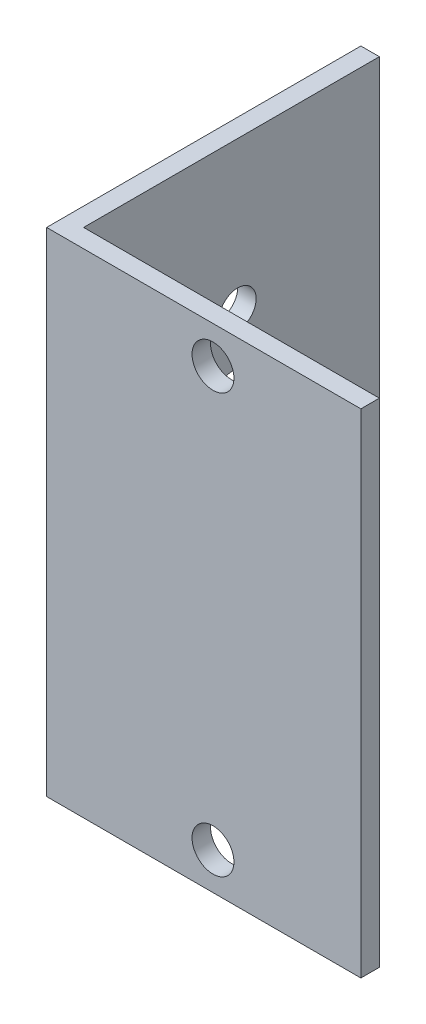
ISO-10303-21;
HEADER;
FILE_DESCRIPTION(('STEP AP214'),'2;1');
FILE_NAME('part.step','',(''),(''),'','','');
FILE_SCHEMA(('AUTOMOTIVE_DESIGN { 1 0 10303 214 1 1 1 1 }'));
ENDSEC;
DATA;
#1=APPLICATION_CONTEXT('core data for automotive mechanical design processes');
#2=APPLICATION_PROTOCOL_DEFINITION('international standard','automotive_design',2000,#1);
#3=PRODUCT_CONTEXT('',#1,'mechanical');
#4=PRODUCT('Part','Part','',(#3));
#5=PRODUCT_RELATED_PRODUCT_CATEGORY('part','',(#4));
#6=PRODUCT_DEFINITION_FORMATION('','',#4);
#7=PRODUCT_DEFINITION_CONTEXT('part definition',#1,'design');
#8=PRODUCT_DEFINITION('design','',#6,#7);
#9=PRODUCT_DEFINITION_SHAPE('','',#8);
#10=(LENGTH_UNIT() NAMED_UNIT(*) SI_UNIT(.MILLI.,.METRE.));
#11=(NAMED_UNIT(*) PLANE_ANGLE_UNIT() SI_UNIT($,.RADIAN.));
#12=(NAMED_UNIT(*) SI_UNIT($,.STERADIAN.) SOLID_ANGLE_UNIT());
#13=UNCERTAINTY_MEASURE_WITH_UNIT(LENGTH_MEASURE(1.E-05),#10,'distance_accuracy_value','');
#14=(GEOMETRIC_REPRESENTATION_CONTEXT(3) GLOBAL_UNCERTAINTY_ASSIGNED_CONTEXT((#13)) GLOBAL_UNIT_ASSIGNED_CONTEXT((#10,
#11,#12)) REPRESENTATION_CONTEXT('',''));
#15=CARTESIAN_POINT('',(0.,0.,0.));
#16=DIRECTION('',(0.,0.,1.));
#17=DIRECTION('',(1.,0.,0.));
#18=AXIS2_PLACEMENT_3D('',#15,#16,#17);
#19=CARTESIAN_POINT('',(24.,40.,0.));
#20=DIRECTION('',(0.,0.,1.));
#21=DIRECTION('',(1.,0.,0.));
#22=AXIS2_PLACEMENT_3D('',#19,#20,#21);
#23=PLANE('',#22);
#24=CARTESIAN_POINT('',(12.,3.,0.));
#25=DIRECTION('',(0.,0.,-1.));
#26=DIRECTION('',(-1.,0.,0.));
#27=AXIS2_PLACEMENT_3D('',#24,#25,#26);
#28=CIRCLE('',#27,1.7);
#29=CARTESIAN_POINT('',(10.3,3.,0.));
#30=VERTEX_POINT('',#29);
#31=EDGE_CURVE('E145',#30,#30,#28,.T.);
#32=ORIENTED_EDGE('',*,*,#31,.F.);
#33=EDGE_LOOP('',(#32));
#34=FACE_BOUND('',#33,.T.);
#35=CARTESIAN_POINT('',(12.,37.,0.));
#36=DIRECTION('',(0.,0.,-1.));
#37=DIRECTION('',(1.,0.,0.));
#38=AXIS2_PLACEMENT_3D('',#35,#36,#37);
#39=CIRCLE('',#38,1.7);
#40=CARTESIAN_POINT('',(13.7,37.,0.));
#41=VERTEX_POINT('',#40);
#42=EDGE_CURVE('E151',#41,#41,#39,.T.);
#43=ORIENTED_EDGE('',*,*,#42,.F.);
#44=EDGE_LOOP('',(#43));
#45=FACE_BOUND('',#44,.T.);
#46=DIRECTION('',(-1.,0.,0.));
#47=VECTOR('',#46,1.);
#48=CARTESIAN_POINT('',(24.,0.,0.));
#49=LINE('',#48,#47);
#50=CARTESIAN_POINT('',(24.,0.,0.));
#51=VERTEX_POINT('',#50);
#52=CARTESIAN_POINT('',(0.,0.,0.));
#53=VERTEX_POINT('',#52);
#54=EDGE_CURVE('E127',#51,#53,#49,.T.);
#55=ORIENTED_EDGE('',*,*,#54,.T.);
#56=DIRECTION('',(0.,-1.,0.));
#57=VECTOR('',#56,1.);
#58=CARTESIAN_POINT('',(0.,40.,0.));
#59=LINE('',#58,#57);
#60=CARTESIAN_POINT('',(0.,40.,0.));
#61=VERTEX_POINT('',#60);
#62=EDGE_CURVE('E12',#61,#53,#59,.T.);
#63=ORIENTED_EDGE('',*,*,#62,.F.);
#64=DIRECTION('',(-1.,0.,0.));
#65=VECTOR('',#64,1.);
#66=CARTESIAN_POINT('',(24.,40.,0.));
#67=LINE('',#66,#65);
#68=CARTESIAN_POINT('',(24.,40.,0.));
#69=VERTEX_POINT('',#68);
#70=EDGE_CURVE('E138',#69,#61,#67,.T.);
#71=ORIENTED_EDGE('',*,*,#70,.F.);
#72=DIRECTION('',(0.,-1.,0.));
#73=VECTOR('',#72,1.);
#74=CARTESIAN_POINT('',(24.,40.,0.));
#75=LINE('',#74,#73);
#76=EDGE_CURVE('E123',#69,#51,#75,.T.);
#77=ORIENTED_EDGE('',*,*,#76,.T.);
#78=EDGE_LOOP('',(#55,#63,#71,#77));
#79=FACE_BOUND('',#78,.T.);
#80=ADVANCED_FACE('F41',(#34,#45,#79),#23,.F.);
#81=CARTESIAN_POINT('',(0.,40.,0.));
#82=DIRECTION('',(-1.,0.,0.));
#83=DIRECTION('',(0.,0.,1.));
#84=AXIS2_PLACEMENT_3D('',#81,#82,#83);
#85=PLANE('',#84);
#86=CARTESIAN_POINT('',(0.,12.,-12.5));
#87=DIRECTION('',(-1.,0.,0.));
#88=DIRECTION('',(0.,0.,1.));
#89=AXIS2_PLACEMENT_3D('',#86,#87,#88);
#90=CIRCLE('',#89,1.5);
#91=CARTESIAN_POINT('',(0.,12.,-11.));
#92=VERTEX_POINT('',#91);
#93=EDGE_CURVE('E149',#92,#92,#90,.F.);
#94=ORIENTED_EDGE('',*,*,#93,.F.);
#95=EDGE_LOOP('',(#94));
#96=FACE_BOUND('',#95,.T.);
#97=CARTESIAN_POINT('',(0.,28.,-12.5));
#98=DIRECTION('',(-1.,0.,0.));
#99=DIRECTION('',(0.,0.,1.));
#100=AXIS2_PLACEMENT_3D('',#97,#98,#99);
#101=CIRCLE('',#100,1.5);
#102=CARTESIAN_POINT('',(0.,28.,-11.));
#103=VERTEX_POINT('',#102);
#104=EDGE_CURVE('E158',#103,#103,#101,.F.);
#105=ORIENTED_EDGE('',*,*,#104,.F.);
#106=EDGE_LOOP('',(#105));
#107=FACE_BOUND('',#106,.T.);
#108=CARTESIAN_POINT('',(0.,20.,-12.5));
#109=DIRECTION('',(-1.,0.,0.));
#110=DIRECTION('',(0.,0.,1.));
#111=AXIS2_PLACEMENT_3D('',#108,#109,#110);
#112=CIRCLE('',#111,3.9);
#113=CARTESIAN_POINT('',(0.,20.,-8.60000000000001));
#114=VERTEX_POINT('',#113);
#115=EDGE_CURVE('E131',#114,#114,#112,.F.);
#116=ORIENTED_EDGE('',*,*,#115,.F.);
#117=EDGE_LOOP('',(#116));
#118=FACE_BOUND('',#117,.T.);
#119=DIRECTION('',(0.,0.,-1.));
#120=VECTOR('',#119,1.);
#121=CARTESIAN_POINT('',(0.,0.,0.));
#122=LINE('',#121,#120);
#123=CARTESIAN_POINT('',(0.,0.,-24.));
#124=VERTEX_POINT('',#123);
#125=EDGE_CURVE('E130',#53,#124,#122,.T.);
#126=ORIENTED_EDGE('',*,*,#125,.T.);
#127=DIRECTION('',(0.,-1.,0.));
#128=VECTOR('',#127,1.);
#129=CARTESIAN_POINT('',(0.,40.,-24.));
#130=LINE('',#129,#128);
#131=CARTESIAN_POINT('',(0.,40.,-24.));
#132=VERTEX_POINT('',#131);
#133=EDGE_CURVE('E50',#132,#124,#130,.T.);
#134=ORIENTED_EDGE('',*,*,#133,.F.);
#135=DIRECTION('',(0.,0.,-1.));
#136=VECTOR('',#135,1.);
#137=CARTESIAN_POINT('',(0.,40.,0.));
#138=LINE('',#137,#136);
#139=EDGE_CURVE('E96',#61,#132,#138,.T.);
#140=ORIENTED_EDGE('',*,*,#139,.F.);
#141=ORIENTED_EDGE('',*,*,#62,.T.);
#142=EDGE_LOOP('',(#126,#134,#140,#141));
#143=FACE_BOUND('',#142,.T.);
#144=ADVANCED_FACE('F177',(#96,#107,#118,#143),#85,.F.);
#145=CARTESIAN_POINT('',(0.,40.,-24.));
#146=DIRECTION('',(0.,0.,1.));
#147=DIRECTION('',(1.,0.,0.));
#148=AXIS2_PLACEMENT_3D('',#145,#146,#147);
#149=PLANE('',#148);
#150=DIRECTION('',(-1.,0.,0.));
#151=VECTOR('',#150,1.);
#152=CARTESIAN_POINT('',(0.,0.,-24.));
#153=LINE('',#152,#151);
#154=CARTESIAN_POINT('',(-1.5,0.,-24.));
#155=VERTEX_POINT('',#154);
#156=EDGE_CURVE('E133',#124,#155,#153,.T.);
#157=ORIENTED_EDGE('',*,*,#156,.T.);
#158=DIRECTION('',(0.,-1.,0.));
#159=VECTOR('',#158,1.);
#160=CARTESIAN_POINT('',(-1.5,40.,-24.));
#161=LINE('',#160,#159);
#162=CARTESIAN_POINT('',(-1.5,40.,-24.));
#163=VERTEX_POINT('',#162);
#164=EDGE_CURVE('E118',#163,#155,#161,.T.);
#165=ORIENTED_EDGE('',*,*,#164,.F.);
#166=DIRECTION('',(-1.,0.,0.));
#167=VECTOR('',#166,1.);
#168=CARTESIAN_POINT('',(0.,40.,-24.));
#169=LINE('',#168,#167);
#170=EDGE_CURVE('E109',#132,#163,#169,.T.);
#171=ORIENTED_EDGE('',*,*,#170,.F.);
#172=ORIENTED_EDGE('',*,*,#133,.T.);
#173=EDGE_LOOP('',(#157,#165,#171,#172));
#174=FACE_BOUND('',#173,.T.);
#175=ADVANCED_FACE('F180',(#174),#149,.F.);
#176=CARTESIAN_POINT('',(-1.5,40.,-24.));
#177=DIRECTION('',(1.,0.,0.));
#178=DIRECTION('',(0.,0.,-1.));
#179=AXIS2_PLACEMENT_3D('',#176,#177,#178);
#180=PLANE('',#179);
#181=CARTESIAN_POINT('',(-1.5,12.,-12.5));
#182=DIRECTION('',(-1.,0.,0.));
#183=DIRECTION('',(0.,0.,1.));
#184=AXIS2_PLACEMENT_3D('',#181,#182,#183);
#185=CIRCLE('',#184,1.5);
#186=CARTESIAN_POINT('',(-1.5,12.,-11.));
#187=VERTEX_POINT('',#186);
#188=EDGE_CURVE('E162',#187,#187,#185,.T.);
#189=ORIENTED_EDGE('',*,*,#188,.F.);
#190=EDGE_LOOP('',(#189));
#191=FACE_BOUND('',#190,.T.);
#192=CARTESIAN_POINT('',(-1.5,28.,-12.5));
#193=DIRECTION('',(-1.,0.,0.));
#194=DIRECTION('',(0.,0.,1.));
#195=AXIS2_PLACEMENT_3D('',#192,#193,#194);
#196=CIRCLE('',#195,1.5);
#197=CARTESIAN_POINT('',(-1.5,28.,-11.));
#198=VERTEX_POINT('',#197);
#199=EDGE_CURVE('E161',#198,#198,#196,.T.);
#200=ORIENTED_EDGE('',*,*,#199,.F.);
#201=EDGE_LOOP('',(#200));
#202=FACE_BOUND('',#201,.T.);
#203=CARTESIAN_POINT('',(-1.5,20.,-12.5));
#204=DIRECTION('',(-1.,0.,0.));
#205=DIRECTION('',(0.,0.,1.));
#206=AXIS2_PLACEMENT_3D('',#203,#204,#205);
#207=CIRCLE('',#206,3.9);
#208=CARTESIAN_POINT('',(-1.5,20.,-8.60000000000001));
#209=VERTEX_POINT('',#208);
#210=EDGE_CURVE('E165',#209,#209,#207,.T.);
#211=ORIENTED_EDGE('',*,*,#210,.F.);
#212=EDGE_LOOP('',(#211));
#213=FACE_BOUND('',#212,.T.);
#214=DIRECTION('',(0.,0.,1.));
#215=VECTOR('',#214,1.);
#216=CARTESIAN_POINT('',(-1.5,0.,-24.));
#217=LINE('',#216,#215);
#218=CARTESIAN_POINT('',(-1.5,0.,1.5));
#219=VERTEX_POINT('',#218);
#220=EDGE_CURVE('E117',#155,#219,#217,.T.);
#221=ORIENTED_EDGE('',*,*,#220,.T.);
#222=DIRECTION('',(0.,-1.,0.));
#223=VECTOR('',#222,1.);
#224=CARTESIAN_POINT('',(-1.5,40.,1.5));
#225=LINE('',#224,#223);
#226=CARTESIAN_POINT('',(-1.5,40.,1.5));
#227=VERTEX_POINT('',#226);
#228=EDGE_CURVE('E114',#227,#219,#225,.T.);
#229=ORIENTED_EDGE('',*,*,#228,.F.);
#230=DIRECTION('',(0.,0.,1.));
#231=VECTOR('',#230,1.);
#232=CARTESIAN_POINT('',(-1.5,40.,-24.));
#233=LINE('',#232,#231);
#234=EDGE_CURVE('E103',#163,#227,#233,.T.);
#235=ORIENTED_EDGE('',*,*,#234,.F.);
#236=ORIENTED_EDGE('',*,*,#164,.T.);
#237=EDGE_LOOP('',(#221,#229,#235,#236));
#238=FACE_BOUND('',#237,.T.);
#239=ADVANCED_FACE('F115',(#191,#202,#213,#238),#180,.F.);
#240=CARTESIAN_POINT('',(-1.5,40.,1.5));
#241=DIRECTION('',(0.,0.,-1.));
#242=DIRECTION('',(-1.,0.,0.));
#243=AXIS2_PLACEMENT_3D('',#240,#241,#242);
#244=PLANE('',#243);
#245=CARTESIAN_POINT('',(12.,3.,1.5));
#246=DIRECTION('',(0.,0.,-1.));
#247=DIRECTION('',(-1.,0.,0.));
#248=AXIS2_PLACEMENT_3D('',#245,#246,#247);
#249=CIRCLE('',#248,1.7);
#250=CARTESIAN_POINT('',(10.3,3.,1.5));
#251=VERTEX_POINT('',#250);
#252=EDGE_CURVE('E44',#251,#251,#249,.T.);
#253=ORIENTED_EDGE('',*,*,#252,.T.);
#254=EDGE_LOOP('',(#253));
#255=FACE_BOUND('',#254,.T.);
#256=CARTESIAN_POINT('',(12.,37.,1.5));
#257=DIRECTION('',(0.,0.,-1.));
#258=DIRECTION('',(-1.,0.,0.));
#259=AXIS2_PLACEMENT_3D('',#256,#257,#258);
#260=CIRCLE('',#259,1.7);
#261=CARTESIAN_POINT('',(10.3,37.,1.5));
#262=VERTEX_POINT('',#261);
#263=EDGE_CURVE('E143',#262,#262,#260,.T.);
#264=ORIENTED_EDGE('',*,*,#263,.T.);
#265=EDGE_LOOP('',(#264));
#266=FACE_BOUND('',#265,.T.);
#267=DIRECTION('',(1.,0.,0.));
#268=VECTOR('',#267,1.);
#269=CARTESIAN_POINT('',(-1.5,0.,1.5));
#270=LINE('',#269,#268);
#271=CARTESIAN_POINT('',(24.,0.,1.5));
#272=VERTEX_POINT('',#271);
#273=EDGE_CURVE('E82',#219,#272,#270,.T.);
#274=ORIENTED_EDGE('',*,*,#273,.T.);
#275=DIRECTION('',(0.,-1.,0.));
#276=VECTOR('',#275,1.);
#277=CARTESIAN_POINT('',(24.,40.,1.5));
#278=LINE('',#277,#276);
#279=CARTESIAN_POINT('',(24.,40.,1.5));
#280=VERTEX_POINT('',#279);
#281=EDGE_CURVE('E119',#280,#272,#278,.T.);
#282=ORIENTED_EDGE('',*,*,#281,.F.);
#283=DIRECTION('',(1.,0.,0.));
#284=VECTOR('',#283,1.);
#285=CARTESIAN_POINT('',(-1.5,40.,1.5));
#286=LINE('',#285,#284);
#287=EDGE_CURVE('E107',#227,#280,#286,.T.);
#288=ORIENTED_EDGE('',*,*,#287,.F.);
#289=ORIENTED_EDGE('',*,*,#228,.T.);
#290=EDGE_LOOP('',(#274,#282,#288,#289));
#291=FACE_BOUND('',#290,.T.);
#292=ADVANCED_FACE('F121',(#255,#266,#291),#244,.F.);
#293=CARTESIAN_POINT('',(24.,40.,1.5));
#294=DIRECTION('',(-1.,0.,0.));
#295=DIRECTION('',(0.,0.,1.));
#296=AXIS2_PLACEMENT_3D('',#293,#294,#295);
#297=PLANE('',#296);
#298=DIRECTION('',(0.,0.,-1.));
#299=VECTOR('',#298,1.);
#300=CARTESIAN_POINT('',(24.,0.,1.5));
#301=LINE('',#300,#299);
#302=EDGE_CURVE('E88',#272,#51,#301,.T.);
#303=ORIENTED_EDGE('',*,*,#302,.T.);
#304=ORIENTED_EDGE('',*,*,#76,.F.);
#305=DIRECTION('',(0.,0.,-1.));
#306=VECTOR('',#305,1.);
#307=CARTESIAN_POINT('',(24.,40.,1.5));
#308=LINE('',#307,#306);
#309=EDGE_CURVE('E59',#280,#69,#308,.T.);
#310=ORIENTED_EDGE('',*,*,#309,.F.);
#311=ORIENTED_EDGE('',*,*,#281,.T.);
#312=EDGE_LOOP('',(#303,#304,#310,#311));
#313=FACE_BOUND('',#312,.T.);
#314=ADVANCED_FACE('F185',(#313),#297,.F.);
#315=CARTESIAN_POINT('',(0.,40.,0.));
#316=DIRECTION('',(0.,-1.,0.));
#317=DIRECTION('',(0.,0.,-1.));
#318=AXIS2_PLACEMENT_3D('',#315,#316,#317);
#319=PLANE('',#318);
#320=ORIENTED_EDGE('',*,*,#70,.T.);
#321=ORIENTED_EDGE('',*,*,#139,.T.);
#322=ORIENTED_EDGE('',*,*,#170,.T.);
#323=ORIENTED_EDGE('',*,*,#234,.T.);
#324=ORIENTED_EDGE('',*,*,#287,.T.);
#325=ORIENTED_EDGE('',*,*,#309,.T.);
#326=EDGE_LOOP('',(#320,#321,#322,#323,#324,#325));
#327=FACE_BOUND('',#326,.T.);
#328=ADVANCED_FACE('F105',(#327),#319,.F.);
#329=CARTESIAN_POINT('',(0.,0.,0.));
#330=DIRECTION('',(0.,-1.,0.));
#331=DIRECTION('',(0.,0.,-1.));
#332=AXIS2_PLACEMENT_3D('',#329,#330,#331);
#333=PLANE('',#332);
#334=ORIENTED_EDGE('',*,*,#54,.F.);
#335=ORIENTED_EDGE('',*,*,#302,.F.);
#336=ORIENTED_EDGE('',*,*,#273,.F.);
#337=ORIENTED_EDGE('',*,*,#220,.F.);
#338=ORIENTED_EDGE('',*,*,#156,.F.);
#339=ORIENTED_EDGE('',*,*,#125,.F.);
#340=EDGE_LOOP('',(#334,#335,#336,#337,#338,#339));
#341=FACE_BOUND('',#340,.T.);
#342=ADVANCED_FACE('F183',(#341),#333,.T.);
#343=CARTESIAN_POINT('',(11.0308657865101,20.,-12.5));
#344=DIRECTION('',(-1.,0.,0.));
#345=DIRECTION('',(0.,0.,1.));
#346=AXIS2_PLACEMENT_3D('',#343,#344,#345);
#347=CYLINDRICAL_SURFACE('',#346,3.9);
#348=ORIENTED_EDGE('',*,*,#115,.T.);
#349=EDGE_LOOP('',(#348));
#350=FACE_BOUND('',#349,.T.);
#351=ORIENTED_EDGE('',*,*,#210,.T.);
#352=EDGE_LOOP('',(#351));
#353=FACE_BOUND('',#352,.T.);
#354=ADVANCED_FACE('F221',(#350,#353),#347,.F.);
#355=CARTESIAN_POINT('',(11.0308657865101,28.,-12.5));
#356=DIRECTION('',(-1.,0.,0.));
#357=DIRECTION('',(0.,0.,1.));
#358=AXIS2_PLACEMENT_3D('',#355,#356,#357);
#359=CYLINDRICAL_SURFACE('',#358,1.5);
#360=ORIENTED_EDGE('',*,*,#104,.T.);
#361=EDGE_LOOP('',(#360));
#362=FACE_BOUND('',#361,.T.);
#363=ORIENTED_EDGE('',*,*,#199,.T.);
#364=EDGE_LOOP('',(#363));
#365=FACE_BOUND('',#364,.T.);
#366=ADVANCED_FACE('F216',(#362,#365),#359,.F.);
#367=CARTESIAN_POINT('',(11.0308657865101,12.,-12.5));
#368=DIRECTION('',(-1.,0.,0.));
#369=DIRECTION('',(0.,0.,1.));
#370=AXIS2_PLACEMENT_3D('',#367,#368,#369);
#371=CYLINDRICAL_SURFACE('',#370,1.5);
#372=ORIENTED_EDGE('',*,*,#93,.T.);
#373=EDGE_LOOP('',(#372));
#374=FACE_BOUND('',#373,.T.);
#375=ORIENTED_EDGE('',*,*,#188,.T.);
#376=EDGE_LOOP('',(#375));
#377=FACE_BOUND('',#376,.T.);
#378=ADVANCED_FACE('F209',(#374,#377),#371,.F.);
#379=CARTESIAN_POINT('',(12.,37.,10.));
#380=DIRECTION('',(0.,0.,-1.));
#381=DIRECTION('',(-1.,0.,0.));
#382=AXIS2_PLACEMENT_3D('',#379,#380,#381);
#383=CYLINDRICAL_SURFACE('',#382,1.7);
#384=ORIENTED_EDGE('',*,*,#42,.T.);
#385=EDGE_LOOP('',(#384));
#386=FACE_BOUND('',#385,.T.);
#387=ORIENTED_EDGE('',*,*,#263,.F.);
#388=EDGE_LOOP('',(#387));
#389=FACE_BOUND('',#388,.T.);
#390=ADVANCED_FACE('F205',(#386,#389),#383,.F.);
#391=CARTESIAN_POINT('',(12.,3.,10.));
#392=DIRECTION('',(0.,0.,-1.));
#393=DIRECTION('',(-1.,0.,0.));
#394=AXIS2_PLACEMENT_3D('',#391,#392,#393);
#395=CYLINDRICAL_SURFACE('',#394,1.7);
#396=ORIENTED_EDGE('',*,*,#31,.T.);
#397=EDGE_LOOP('',(#396));
#398=FACE_BOUND('',#397,.T.);
#399=ORIENTED_EDGE('',*,*,#252,.F.);
#400=EDGE_LOOP('',(#399));
#401=FACE_BOUND('',#400,.T.);
#402=ADVANCED_FACE('F208',(#398,#401),#395,.F.);
#403=CLOSED_SHELL('',(#80,#144,#175,#239,#292,#314,#328,#342,#354,#366,#378,#390,#402));
#404=MANIFOLD_SOLID_BREP('B2',#403);
#405=ADVANCED_BREP_SHAPE_REPRESENTATION('',(#18,#404),#14);
#406=SHAPE_DEFINITION_REPRESENTATION(#9,#405);
ENDSEC;
END-ISO-10303-21;
